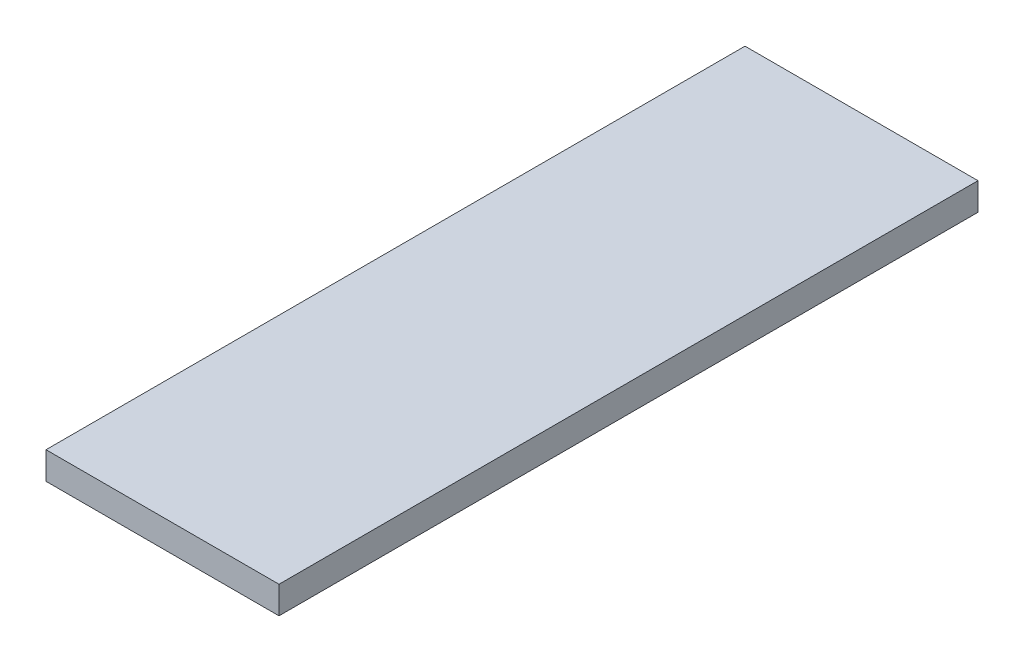
ISO-10303-21;
HEADER;
FILE_DESCRIPTION(('STEP AP214'),'2;1');
FILE_NAME('part.step','',(''),(''),'','','');
FILE_SCHEMA(('AUTOMOTIVE_DESIGN { 1 0 10303 214 1 1 1 1 }'));
ENDSEC;
DATA;
#1=APPLICATION_CONTEXT('core data for automotive mechanical design processes');
#2=APPLICATION_PROTOCOL_DEFINITION('international standard','automotive_design',2000,#1);
#3=PRODUCT_CONTEXT('',#1,'mechanical');
#4=PRODUCT('Part','Part','',(#3));
#5=PRODUCT_RELATED_PRODUCT_CATEGORY('part','',(#4));
#6=PRODUCT_DEFINITION_FORMATION('','',#4);
#7=PRODUCT_DEFINITION_CONTEXT('part definition',#1,'design');
#8=PRODUCT_DEFINITION('design','',#6,#7);
#9=PRODUCT_DEFINITION_SHAPE('','',#8);
#10=(LENGTH_UNIT() NAMED_UNIT(*) SI_UNIT(.MILLI.,.METRE.));
#11=(NAMED_UNIT(*) PLANE_ANGLE_UNIT() SI_UNIT($,.RADIAN.));
#12=(NAMED_UNIT(*) SI_UNIT($,.STERADIAN.) SOLID_ANGLE_UNIT());
#13=UNCERTAINTY_MEASURE_WITH_UNIT(LENGTH_MEASURE(1.E-05),#10,'distance_accuracy_value','');
#14=(GEOMETRIC_REPRESENTATION_CONTEXT(3) GLOBAL_UNCERTAINTY_ASSIGNED_CONTEXT((#13)) GLOBAL_UNIT_ASSIGNED_CONTEXT((#10,
#11,#12)) REPRESENTATION_CONTEXT('',''));
#15=CARTESIAN_POINT('',(0.,0.,0.));
#16=DIRECTION('',(0.,0.,1.));
#17=DIRECTION('',(1.,0.,0.));
#18=AXIS2_PLACEMENT_3D('',#15,#16,#17);
#19=CARTESIAN_POINT('',(0.,0.,304.8));
#20=DIRECTION('',(1.,0.,0.));
#21=DIRECTION('',(0.,0.,-1.));
#22=AXIS2_PLACEMENT_3D('',#19,#20,#21);
#23=PLANE('',#22);
#24=DIRECTION('',(0.,-1.,0.));
#25=VECTOR('',#24,1.);
#26=CARTESIAN_POINT('',(0.,0.,0.));
#27=LINE('',#26,#25);
#28=CARTESIAN_POINT('',(0.,11.938,0.));
#29=VERTEX_POINT('',#28);
#30=CARTESIAN_POINT('',(0.,0.,0.));
#31=VERTEX_POINT('',#30);
#32=EDGE_CURVE('E93',#29,#31,#27,.T.);
#33=ORIENTED_EDGE('',*,*,#32,.T.);
#34=DIRECTION('',(0.,0.,-1.));
#35=VECTOR('',#34,1.);
#36=CARTESIAN_POINT('',(0.,0.,304.8));
#37=LINE('',#36,#35);
#38=CARTESIAN_POINT('',(0.,0.,304.8));
#39=VERTEX_POINT('',#38);
#40=EDGE_CURVE('E11',#39,#31,#37,.T.);
#41=ORIENTED_EDGE('',*,*,#40,.F.);
#42=DIRECTION('',(0.,-1.,0.));
#43=VECTOR('',#42,1.);
#44=CARTESIAN_POINT('',(0.,0.,304.8));
#45=LINE('',#44,#43);
#46=CARTESIAN_POINT('',(0.,11.938,304.8));
#47=VERTEX_POINT('',#46);
#48=EDGE_CURVE('E81',#47,#39,#45,.T.);
#49=ORIENTED_EDGE('',*,*,#48,.F.);
#50=DIRECTION('',(0.,0.,-1.));
#51=VECTOR('',#50,1.);
#52=CARTESIAN_POINT('',(0.,11.938,304.8));
#53=LINE('',#52,#51);
#54=EDGE_CURVE('E89',#47,#29,#53,.T.);
#55=ORIENTED_EDGE('',*,*,#54,.T.);
#56=EDGE_LOOP('',(#33,#41,#49,#55));
#57=FACE_BOUND('',#56,.T.);
#58=ADVANCED_FACE('F30',(#57),#23,.F.);
#59=CARTESIAN_POINT('',(0.,0.,304.8));
#60=DIRECTION('',(0.,1.,0.));
#61=DIRECTION('',(0.,0.,1.));
#62=AXIS2_PLACEMENT_3D('',#59,#60,#61);
#63=PLANE('',#62);
#64=DIRECTION('',(1.,0.,0.));
#65=VECTOR('',#64,1.);
#66=CARTESIAN_POINT('',(0.,0.,0.));
#67=LINE('',#66,#65);
#68=CARTESIAN_POINT('',(101.6,0.,0.));
#69=VERTEX_POINT('',#68);
#70=EDGE_CURVE('E85',#31,#69,#67,.T.);
#71=ORIENTED_EDGE('',*,*,#70,.T.);
#72=DIRECTION('',(0.,0.,-1.));
#73=VECTOR('',#72,1.);
#74=CARTESIAN_POINT('',(101.6,0.,304.8));
#75=LINE('',#74,#73);
#76=CARTESIAN_POINT('',(101.6,0.,304.8));
#77=VERTEX_POINT('',#76);
#78=EDGE_CURVE('E38',#77,#69,#75,.T.);
#79=ORIENTED_EDGE('',*,*,#78,.F.);
#80=DIRECTION('',(1.,0.,0.));
#81=VECTOR('',#80,1.);
#82=CARTESIAN_POINT('',(0.,0.,304.8));
#83=LINE('',#82,#81);
#84=EDGE_CURVE('E76',#39,#77,#83,.T.);
#85=ORIENTED_EDGE('',*,*,#84,.F.);
#86=ORIENTED_EDGE('',*,*,#40,.T.);
#87=EDGE_LOOP('',(#71,#79,#85,#86));
#88=FACE_BOUND('',#87,.T.);
#89=ADVANCED_FACE('F84',(#88),#63,.F.);
#90=CARTESIAN_POINT('',(101.6,0.,304.8));
#91=DIRECTION('',(-1.,0.,0.));
#92=DIRECTION('',(0.,0.,1.));
#93=AXIS2_PLACEMENT_3D('',#90,#91,#92);
#94=PLANE('',#93);
#95=DIRECTION('',(0.,1.,0.));
#96=VECTOR('',#95,1.);
#97=CARTESIAN_POINT('',(101.6,0.,0.));
#98=LINE('',#97,#96);
#99=CARTESIAN_POINT('',(101.6,11.938,0.));
#100=VERTEX_POINT('',#99);
#101=EDGE_CURVE('E63',#69,#100,#98,.T.);
#102=ORIENTED_EDGE('',*,*,#101,.T.);
#103=DIRECTION('',(0.,0.,-1.));
#104=VECTOR('',#103,1.);
#105=CARTESIAN_POINT('',(101.6,11.938,304.8));
#106=LINE('',#105,#104);
#107=CARTESIAN_POINT('',(101.6,11.938,304.8));
#108=VERTEX_POINT('',#107);
#109=EDGE_CURVE('E86',#108,#100,#106,.T.);
#110=ORIENTED_EDGE('',*,*,#109,.F.);
#111=DIRECTION('',(0.,1.,0.));
#112=VECTOR('',#111,1.);
#113=CARTESIAN_POINT('',(101.6,0.,304.8));
#114=LINE('',#113,#112);
#115=EDGE_CURVE('E79',#77,#108,#114,.T.);
#116=ORIENTED_EDGE('',*,*,#115,.F.);
#117=ORIENTED_EDGE('',*,*,#78,.T.);
#118=EDGE_LOOP('',(#102,#110,#116,#117));
#119=FACE_BOUND('',#118,.T.);
#120=ADVANCED_FACE('F87',(#119),#94,.F.);
#121=CARTESIAN_POINT('',(0.,11.938,304.8));
#122=DIRECTION('',(0.,-1.,0.));
#123=DIRECTION('',(0.,0.,-1.));
#124=AXIS2_PLACEMENT_3D('',#121,#122,#123);
#125=PLANE('',#124);
#126=DIRECTION('',(-1.,0.,0.));
#127=VECTOR('',#126,1.);
#128=CARTESIAN_POINT('',(0.,11.938,0.));
#129=LINE('',#128,#127);
#130=EDGE_CURVE('E69',#100,#29,#129,.T.);
#131=ORIENTED_EDGE('',*,*,#130,.T.);
#132=ORIENTED_EDGE('',*,*,#54,.F.);
#133=DIRECTION('',(-1.,0.,0.));
#134=VECTOR('',#133,1.);
#135=CARTESIAN_POINT('',(0.,11.938,304.8));
#136=LINE('',#135,#134);
#137=EDGE_CURVE('E46',#108,#47,#136,.T.);
#138=ORIENTED_EDGE('',*,*,#137,.F.);
#139=ORIENTED_EDGE('',*,*,#109,.T.);
#140=EDGE_LOOP('',(#131,#132,#138,#139));
#141=FACE_BOUND('',#140,.T.);
#142=ADVANCED_FACE('F100',(#141),#125,.F.);
#143=CARTESIAN_POINT('',(0.,0.,304.8));
#144=DIRECTION('',(0.,0.,-1.));
#145=DIRECTION('',(-1.,0.,0.));
#146=AXIS2_PLACEMENT_3D('',#143,#144,#145);
#147=PLANE('',#146);
#148=ORIENTED_EDGE('',*,*,#48,.T.);
#149=ORIENTED_EDGE('',*,*,#84,.T.);
#150=ORIENTED_EDGE('',*,*,#115,.T.);
#151=ORIENTED_EDGE('',*,*,#137,.T.);
#152=EDGE_LOOP('',(#148,#149,#150,#151));
#153=FACE_BOUND('',#152,.T.);
#154=ADVANCED_FACE('F77',(#153),#147,.F.);
#155=CARTESIAN_POINT('',(0.,0.,0.));
#156=DIRECTION('',(0.,0.,-1.));
#157=DIRECTION('',(-1.,0.,0.));
#158=AXIS2_PLACEMENT_3D('',#155,#156,#157);
#159=PLANE('',#158);
#160=ORIENTED_EDGE('',*,*,#32,.F.);
#161=ORIENTED_EDGE('',*,*,#130,.F.);
#162=ORIENTED_EDGE('',*,*,#101,.F.);
#163=ORIENTED_EDGE('',*,*,#70,.F.);
#164=EDGE_LOOP('',(#160,#161,#162,#163));
#165=FACE_BOUND('',#164,.T.);
#166=ADVANCED_FACE('F103',(#165),#159,.T.);
#167=CLOSED_SHELL('',(#58,#89,#120,#142,#154,#166));
#168=MANIFOLD_SOLID_BREP('B2',#167);
#169=ADVANCED_BREP_SHAPE_REPRESENTATION('',(#18,#168),#14);
#170=SHAPE_DEFINITION_REPRESENTATION(#9,#169);
ENDSEC;
END-ISO-10303-21;
